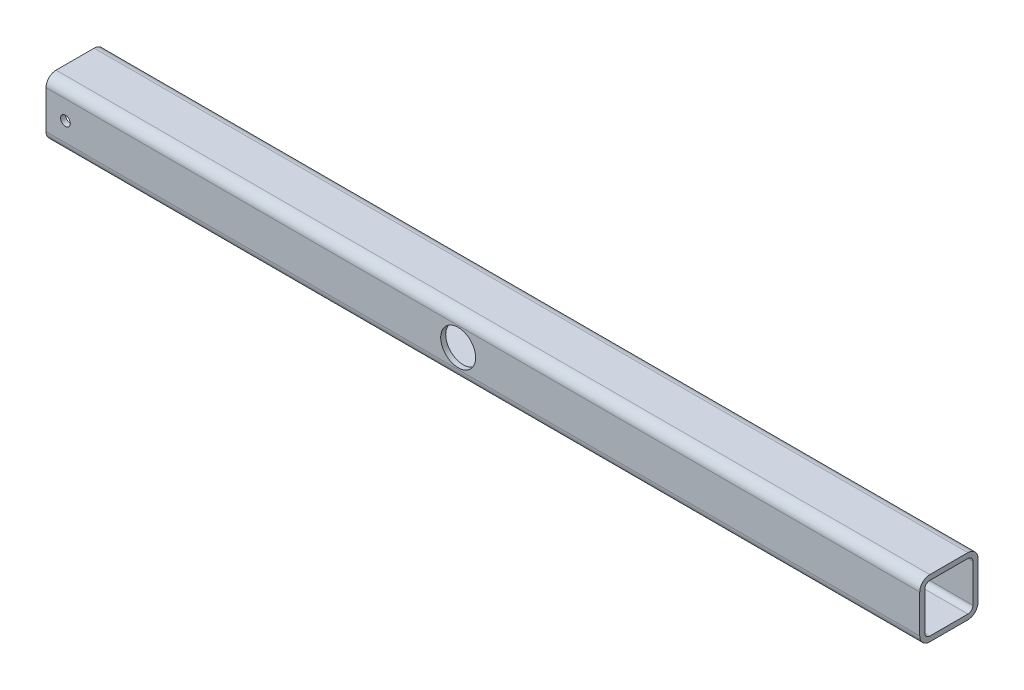
ISO-10303-21;
HEADER;
FILE_DESCRIPTION(('STEP AP214'),'2;1');
FILE_NAME('part.step','',(''),(''),'','','');
FILE_SCHEMA(('AUTOMOTIVE_DESIGN { 1 0 10303 214 1 1 1 1 }'));
ENDSEC;
DATA;
#1=APPLICATION_CONTEXT('core data for automotive mechanical design processes');
#2=APPLICATION_PROTOCOL_DEFINITION('international standard','automotive_design',2000,#1);
#3=PRODUCT_CONTEXT('',#1,'mechanical');
#4=PRODUCT('Part','Part','',(#3));
#5=PRODUCT_RELATED_PRODUCT_CATEGORY('part','',(#4));
#6=PRODUCT_DEFINITION_FORMATION('','',#4);
#7=PRODUCT_DEFINITION_CONTEXT('part definition',#1,'design');
#8=PRODUCT_DEFINITION('design','',#6,#7);
#9=PRODUCT_DEFINITION_SHAPE('','',#8);
#10=(LENGTH_UNIT() NAMED_UNIT(*) SI_UNIT(.MILLI.,.METRE.));
#11=(NAMED_UNIT(*) PLANE_ANGLE_UNIT() SI_UNIT($,.RADIAN.));
#12=(NAMED_UNIT(*) SI_UNIT($,.STERADIAN.) SOLID_ANGLE_UNIT());
#13=UNCERTAINTY_MEASURE_WITH_UNIT(LENGTH_MEASURE(1.E-05),#10,'distance_accuracy_value','');
#14=(GEOMETRIC_REPRESENTATION_CONTEXT(3) GLOBAL_UNCERTAINTY_ASSIGNED_CONTEXT((#13)) GLOBAL_UNIT_ASSIGNED_CONTEXT((#10,
#11,#12)) REPRESENTATION_CONTEXT('',''));
#15=CARTESIAN_POINT('',(0.,0.,0.));
#16=DIRECTION('',(0.,0.,1.));
#17=DIRECTION('',(1.,0.,0.));
#18=AXIS2_PLACEMENT_3D('',#15,#16,#17);
#19=CARTESIAN_POINT('',(225.,9.8,-9.8));
#20=DIRECTION('',(-1.,0.,0.));
#21=DIRECTION('',(0.,0.,1.));
#22=AXIS2_PLACEMENT_3D('',#19,#20,#21);
#23=CYLINDRICAL_SURFACE('',#22,5.2);
#24=CARTESIAN_POINT('',(-225.,9.8,-9.8));
#25=DIRECTION('',(1.,0.,0.));
#26=DIRECTION('',(0.,0.,-1.));
#27=AXIS2_PLACEMENT_3D('',#24,#25,#26);
#28=CIRCLE('',#27,5.2);
#29=CARTESIAN_POINT('',(-225.,9.8,-15.));
#30=VERTEX_POINT('',#29);
#31=CARTESIAN_POINT('',(-225.,15.,-9.8));
#32=VERTEX_POINT('',#31);
#33=EDGE_CURVE('E235',#30,#32,#28,.T.);
#34=ORIENTED_EDGE('',*,*,#33,.T.);
#35=DIRECTION('',(-1.,0.,0.));
#36=VECTOR('',#35,1.);
#37=CARTESIAN_POINT('',(225.,15.,-9.8));
#38=LINE('',#37,#36);
#39=CARTESIAN_POINT('',(225.,15.,-9.8));
#40=VERTEX_POINT('',#39);
#41=EDGE_CURVE('E12',#40,#32,#38,.T.);
#42=ORIENTED_EDGE('',*,*,#41,.F.);
#43=CARTESIAN_POINT('',(225.,9.8,-9.8));
#44=DIRECTION('',(1.,0.,0.));
#45=DIRECTION('',(0.,0.,-1.));
#46=AXIS2_PLACEMENT_3D('',#43,#44,#45);
#47=CIRCLE('',#46,5.2);
#48=CARTESIAN_POINT('',(225.,9.8,-15.));
#49=VERTEX_POINT('',#48);
#50=EDGE_CURVE('E313',#49,#40,#47,.T.);
#51=ORIENTED_EDGE('',*,*,#50,.F.);
#52=DIRECTION('',(-1.,0.,0.));
#53=VECTOR('',#52,1.);
#54=CARTESIAN_POINT('',(225.,9.8,-15.));
#55=LINE('',#54,#53);
#56=EDGE_CURVE('E250',#49,#30,#55,.T.);
#57=ORIENTED_EDGE('',*,*,#56,.T.);
#58=EDGE_LOOP('',(#34,#42,#51,#57));
#59=FACE_BOUND('',#58,.T.);
#60=ADVANCED_FACE('F62',(#59),#23,.T.);
#61=CARTESIAN_POINT('',(225.,15.,-9.8));
#62=DIRECTION('',(0.,-1.,0.));
#63=DIRECTION('',(0.,0.,-1.));
#64=AXIS2_PLACEMENT_3D('',#61,#62,#63);
#65=PLANE('',#64);
#66=DIRECTION('',(0.,0.,1.));
#67=VECTOR('',#66,1.);
#68=CARTESIAN_POINT('',(-225.,15.,-9.8));
#69=LINE('',#68,#67);
#70=CARTESIAN_POINT('',(-225.,15.,9.8));
#71=VERTEX_POINT('',#70);
#72=EDGE_CURVE('E238',#32,#71,#69,.T.);
#73=ORIENTED_EDGE('',*,*,#72,.T.);
#74=DIRECTION('',(-1.,0.,0.));
#75=VECTOR('',#74,1.);
#76=CARTESIAN_POINT('',(225.,15.,9.8));
#77=LINE('',#76,#75);
#78=CARTESIAN_POINT('',(225.,15.,9.8));
#79=VERTEX_POINT('',#78);
#80=EDGE_CURVE('E72',#79,#71,#77,.T.);
#81=ORIENTED_EDGE('',*,*,#80,.F.);
#82=DIRECTION('',(0.,0.,1.));
#83=VECTOR('',#82,1.);
#84=CARTESIAN_POINT('',(225.,15.,-9.8));
#85=LINE('',#84,#83);
#86=EDGE_CURVE('E315',#40,#79,#85,.T.);
#87=ORIENTED_EDGE('',*,*,#86,.F.);
#88=ORIENTED_EDGE('',*,*,#41,.T.);
#89=EDGE_LOOP('',(#73,#81,#87,#88));
#90=FACE_BOUND('',#89,.T.);
#91=ADVANCED_FACE('F353',(#90),#65,.F.);
#92=CARTESIAN_POINT('',(225.,9.8,9.8));
#93=DIRECTION('',(-1.,0.,0.));
#94=DIRECTION('',(0.,0.,1.));
#95=AXIS2_PLACEMENT_3D('',#92,#93,#94);
#96=CYLINDRICAL_SURFACE('',#95,5.2);
#97=CARTESIAN_POINT('',(-225.,9.8,9.8));
#98=DIRECTION('',(1.,0.,0.));
#99=DIRECTION('',(0.,0.,-1.));
#100=AXIS2_PLACEMENT_3D('',#97,#98,#99);
#101=CIRCLE('',#100,5.2);
#102=CARTESIAN_POINT('',(-225.,9.8,15.));
#103=VERTEX_POINT('',#102);
#104=EDGE_CURVE('E240',#71,#103,#101,.T.);
#105=ORIENTED_EDGE('',*,*,#104,.T.);
#106=DIRECTION('',(-1.,0.,0.));
#107=VECTOR('',#106,1.);
#108=CARTESIAN_POINT('',(225.,9.8,15.));
#109=LINE('',#108,#107);
#110=CARTESIAN_POINT('',(225.,9.8,15.));
#111=VERTEX_POINT('',#110);
#112=EDGE_CURVE('E257',#111,#103,#109,.T.);
#113=ORIENTED_EDGE('',*,*,#112,.F.);
#114=CARTESIAN_POINT('',(225.,9.8,9.8));
#115=DIRECTION('',(1.,0.,0.));
#116=DIRECTION('',(0.,0.,-1.));
#117=AXIS2_PLACEMENT_3D('',#114,#115,#116);
#118=CIRCLE('',#117,5.2);
#119=EDGE_CURVE('E317',#79,#111,#118,.T.);
#120=ORIENTED_EDGE('',*,*,#119,.F.);
#121=ORIENTED_EDGE('',*,*,#80,.T.);
#122=EDGE_LOOP('',(#105,#113,#120,#121));
#123=FACE_BOUND('',#122,.T.);
#124=ADVANCED_FACE('F358',(#123),#96,.T.);
#125=CARTESIAN_POINT('',(225.,-9.8,15.));
#126=DIRECTION('',(0.,0.,-1.));
#127=DIRECTION('',(-1.,0.,0.));
#128=AXIS2_PLACEMENT_3D('',#125,#126,#127);
#129=PLANE('',#128);
#130=CARTESIAN_POINT('',(-215.,0.,15.));
#131=DIRECTION('',(0.,0.,1.));
#132=DIRECTION('',(1.,0.,0.));
#133=AXIS2_PLACEMENT_3D('',#130,#131,#132);
#134=CIRCLE('',#133,2.5);
#135=CARTESIAN_POINT('',(-212.5,0.,15.));
#136=VERTEX_POINT('',#135);
#137=EDGE_CURVE('E524',#136,#136,#134,.T.);
#138=ORIENTED_EDGE('',*,*,#137,.F.);
#139=EDGE_LOOP('',(#138));
#140=FACE_BOUND('',#139,.T.);
#141=CARTESIAN_POINT('',(-12.73,0.,15.));
#142=DIRECTION('',(0.,0.,1.));
#143=DIRECTION('',(1.,0.,0.));
#144=AXIS2_PLACEMENT_3D('',#141,#142,#143);
#145=CIRCLE('',#144,9.);
#146=CARTESIAN_POINT('',(-3.72999999999999,0.,15.));
#147=VERTEX_POINT('',#146);
#148=EDGE_CURVE('E531',#147,#147,#145,.T.);
#149=ORIENTED_EDGE('',*,*,#148,.F.);
#150=EDGE_LOOP('',(#149));
#151=FACE_BOUND('',#150,.T.);
#152=DIRECTION('',(0.,-1.,0.));
#153=VECTOR('',#152,1.);
#154=CARTESIAN_POINT('',(-225.,-9.8,15.));
#155=LINE('',#154,#153);
#156=CARTESIAN_POINT('',(-225.,-9.8,15.));
#157=VERTEX_POINT('',#156);
#158=EDGE_CURVE('E242',#103,#157,#155,.T.);
#159=ORIENTED_EDGE('',*,*,#158,.T.);
#160=DIRECTION('',(-1.,0.,0.));
#161=VECTOR('',#160,1.);
#162=CARTESIAN_POINT('',(225.,-9.8,15.));
#163=LINE('',#162,#161);
#164=CARTESIAN_POINT('',(225.,-9.8,15.));
#165=VERTEX_POINT('',#164);
#166=EDGE_CURVE('E254',#165,#157,#163,.T.);
#167=ORIENTED_EDGE('',*,*,#166,.F.);
#168=DIRECTION('',(0.,-1.,0.));
#169=VECTOR('',#168,1.);
#170=CARTESIAN_POINT('',(225.,-9.8,15.));
#171=LINE('',#170,#169);
#172=EDGE_CURVE('E319',#111,#165,#171,.T.);
#173=ORIENTED_EDGE('',*,*,#172,.F.);
#174=ORIENTED_EDGE('',*,*,#112,.T.);
#175=EDGE_LOOP('',(#159,#167,#173,#174));
#176=FACE_BOUND('',#175,.T.);
#177=ADVANCED_FACE('F325',(#140,#151,#176),#129,.F.);
#178=CARTESIAN_POINT('',(225.,-9.8,9.8));
#179=DIRECTION('',(-1.,0.,0.));
#180=DIRECTION('',(0.,0.,1.));
#181=AXIS2_PLACEMENT_3D('',#178,#179,#180);
#182=CYLINDRICAL_SURFACE('',#181,5.2);
#183=CARTESIAN_POINT('',(-225.,-9.8,9.8));
#184=DIRECTION('',(1.,0.,0.));
#185=DIRECTION('',(0.,0.,-1.));
#186=AXIS2_PLACEMENT_3D('',#183,#184,#185);
#187=CIRCLE('',#186,5.2);
#188=CARTESIAN_POINT('',(-225.,-15.,9.8));
#189=VERTEX_POINT('',#188);
#190=EDGE_CURVE('E244',#157,#189,#187,.T.);
#191=ORIENTED_EDGE('',*,*,#190,.T.);
#192=DIRECTION('',(-1.,0.,0.));
#193=VECTOR('',#192,1.);
#194=CARTESIAN_POINT('',(225.,-15.,9.8));
#195=LINE('',#194,#193);
#196=CARTESIAN_POINT('',(225.,-15.,9.8));
#197=VERTEX_POINT('',#196);
#198=EDGE_CURVE('E201',#197,#189,#195,.T.);
#199=ORIENTED_EDGE('',*,*,#198,.F.);
#200=CARTESIAN_POINT('',(225.,-9.8,9.8));
#201=DIRECTION('',(1.,0.,0.));
#202=DIRECTION('',(0.,0.,-1.));
#203=AXIS2_PLACEMENT_3D('',#200,#201,#202);
#204=CIRCLE('',#203,5.2);
#205=EDGE_CURVE('E192',#165,#197,#204,.T.);
#206=ORIENTED_EDGE('',*,*,#205,.F.);
#207=ORIENTED_EDGE('',*,*,#166,.T.);
#208=EDGE_LOOP('',(#191,#199,#206,#207));
#209=FACE_BOUND('',#208,.T.);
#210=ADVANCED_FACE('F329',(#209),#182,.T.);
#211=CARTESIAN_POINT('',(225.,-15.,9.8));
#212=DIRECTION('',(0.,1.,0.));
#213=DIRECTION('',(0.,0.,1.));
#214=AXIS2_PLACEMENT_3D('',#211,#212,#213);
#215=PLANE('',#214);
#216=DIRECTION('',(0.,0.,-1.));
#217=VECTOR('',#216,1.);
#218=CARTESIAN_POINT('',(-225.,-15.,9.8));
#219=LINE('',#218,#217);
#220=CARTESIAN_POINT('',(-225.,-15.,-9.8));
#221=VERTEX_POINT('',#220);
#222=EDGE_CURVE('E200',#189,#221,#219,.T.);
#223=ORIENTED_EDGE('',*,*,#222,.T.);
#224=DIRECTION('',(-1.,0.,0.));
#225=VECTOR('',#224,1.);
#226=CARTESIAN_POINT('',(225.,-15.,-9.8));
#227=LINE('',#226,#225);
#228=CARTESIAN_POINT('',(225.,-15.,-9.8));
#229=VERTEX_POINT('',#228);
#230=EDGE_CURVE('E197',#229,#221,#227,.T.);
#231=ORIENTED_EDGE('',*,*,#230,.F.);
#232=DIRECTION('',(0.,0.,-1.));
#233=VECTOR('',#232,1.);
#234=CARTESIAN_POINT('',(225.,-15.,9.8));
#235=LINE('',#234,#233);
#236=EDGE_CURVE('E186',#197,#229,#235,.T.);
#237=ORIENTED_EDGE('',*,*,#236,.F.);
#238=ORIENTED_EDGE('',*,*,#198,.T.);
#239=EDGE_LOOP('',(#223,#231,#237,#238));
#240=FACE_BOUND('',#239,.T.);
#241=ADVANCED_FACE('F198',(#240),#215,.F.);
#242=CARTESIAN_POINT('',(225.,-9.8,-9.8));
#243=DIRECTION('',(-1.,0.,0.));
#244=DIRECTION('',(0.,0.,1.));
#245=AXIS2_PLACEMENT_3D('',#242,#243,#244);
#246=CYLINDRICAL_SURFACE('',#245,5.2);
#247=CARTESIAN_POINT('',(-225.,-9.8,-9.8));
#248=DIRECTION('',(1.,0.,0.));
#249=DIRECTION('',(0.,0.,-1.));
#250=AXIS2_PLACEMENT_3D('',#247,#248,#249);
#251=CIRCLE('',#250,5.2);
#252=CARTESIAN_POINT('',(-225.,-9.8,-15.));
#253=VERTEX_POINT('',#252);
#254=EDGE_CURVE('E134',#221,#253,#251,.T.);
#255=ORIENTED_EDGE('',*,*,#254,.T.);
#256=DIRECTION('',(-1.,0.,0.));
#257=VECTOR('',#256,1.);
#258=CARTESIAN_POINT('',(225.,-9.8,-15.));
#259=LINE('',#258,#257);
#260=CARTESIAN_POINT('',(225.,-9.8,-15.));
#261=VERTEX_POINT('',#260);
#262=EDGE_CURVE('E202',#261,#253,#259,.T.);
#263=ORIENTED_EDGE('',*,*,#262,.F.);
#264=CARTESIAN_POINT('',(225.,-9.8,-9.8));
#265=DIRECTION('',(1.,0.,0.));
#266=DIRECTION('',(0.,0.,-1.));
#267=AXIS2_PLACEMENT_3D('',#264,#265,#266);
#268=CIRCLE('',#267,5.2);
#269=EDGE_CURVE('E190',#229,#261,#268,.T.);
#270=ORIENTED_EDGE('',*,*,#269,.F.);
#271=ORIENTED_EDGE('',*,*,#230,.T.);
#272=EDGE_LOOP('',(#255,#263,#270,#271));
#273=FACE_BOUND('',#272,.T.);
#274=ADVANCED_FACE('F204',(#273),#246,.T.);
#275=CARTESIAN_POINT('',(225.,9.8,9.8));
#276=DIRECTION('',(-1.,0.,0.));
#277=DIRECTION('',(0.,0.,1.));
#278=AXIS2_PLACEMENT_3D('',#275,#276,#277);
#279=CYLINDRICAL_SURFACE('',#278,2.6);
#280=CARTESIAN_POINT('',(-225.,9.8,9.8));
#281=DIRECTION('',(1.,0.,0.));
#282=DIRECTION('',(0.,0.,-1.));
#283=AXIS2_PLACEMENT_3D('',#280,#281,#282);
#284=CIRCLE('',#283,2.6);
#285=CARTESIAN_POINT('',(-225.,12.4,9.8));
#286=VERTEX_POINT('',#285);
#287=CARTESIAN_POINT('',(-225.,9.8,12.4));
#288=VERTEX_POINT('',#287);
#289=EDGE_CURVE('E210',#286,#288,#284,.T.);
#290=ORIENTED_EDGE('',*,*,#289,.F.);
#291=DIRECTION('',(-1.,0.,0.));
#292=VECTOR('',#291,1.);
#293=CARTESIAN_POINT('',(225.,12.4,9.8));
#294=LINE('',#293,#292);
#295=CARTESIAN_POINT('',(225.,12.4,9.8));
#296=VERTEX_POINT('',#295);
#297=EDGE_CURVE('E66',#296,#286,#294,.T.);
#298=ORIENTED_EDGE('',*,*,#297,.F.);
#299=CARTESIAN_POINT('',(225.,9.8,9.8));
#300=DIRECTION('',(1.,0.,0.));
#301=DIRECTION('',(0.,0.,-1.));
#302=AXIS2_PLACEMENT_3D('',#299,#300,#301);
#303=CIRCLE('',#302,2.6);
#304=CARTESIAN_POINT('',(225.,9.8,12.4));
#305=VERTEX_POINT('',#304);
#306=EDGE_CURVE('E249',#296,#305,#303,.T.);
#307=ORIENTED_EDGE('',*,*,#306,.T.);
#308=DIRECTION('',(-1.,0.,0.));
#309=VECTOR('',#308,1.);
#310=CARTESIAN_POINT('',(225.,9.8,12.4));
#311=LINE('',#310,#309);
#312=EDGE_CURVE('E206',#305,#288,#311,.T.);
#313=ORIENTED_EDGE('',*,*,#312,.T.);
#314=EDGE_LOOP('',(#290,#298,#307,#313));
#315=FACE_BOUND('',#314,.T.);
#316=ADVANCED_FACE('F64',(#315),#279,.F.);
#317=CARTESIAN_POINT('',(225.,12.4,-9.8));
#318=DIRECTION('',(0.,-1.,0.));
#319=DIRECTION('',(0.,0.,-1.));
#320=AXIS2_PLACEMENT_3D('',#317,#318,#319);
#321=PLANE('',#320);
#322=DIRECTION('',(0.,0.,1.));
#323=VECTOR('',#322,1.);
#324=CARTESIAN_POINT('',(-225.,12.4,-9.8));
#325=LINE('',#324,#323);
#326=CARTESIAN_POINT('',(-225.,12.4,-9.8));
#327=VERTEX_POINT('',#326);
#328=EDGE_CURVE('E213',#327,#286,#325,.T.);
#329=ORIENTED_EDGE('',*,*,#328,.F.);
#330=DIRECTION('',(-1.,0.,0.));
#331=VECTOR('',#330,1.);
#332=CARTESIAN_POINT('',(225.,12.4,-9.8));
#333=LINE('',#332,#331);
#334=CARTESIAN_POINT('',(225.,12.4,-9.8));
#335=VERTEX_POINT('',#334);
#336=EDGE_CURVE('E272',#335,#327,#333,.T.);
#337=ORIENTED_EDGE('',*,*,#336,.F.);
#338=DIRECTION('',(0.,0.,1.));
#339=VECTOR('',#338,1.);
#340=CARTESIAN_POINT('',(225.,12.4,-9.8));
#341=LINE('',#340,#339);
#342=EDGE_CURVE('E281',#335,#296,#341,.T.);
#343=ORIENTED_EDGE('',*,*,#342,.T.);
#344=ORIENTED_EDGE('',*,*,#297,.T.);
#345=EDGE_LOOP('',(#329,#337,#343,#344));
#346=FACE_BOUND('',#345,.T.);
#347=ADVANCED_FACE('F279',(#346),#321,.T.);
#348=CARTESIAN_POINT('',(225.,9.8,-9.8));
#349=DIRECTION('',(-1.,0.,0.));
#350=DIRECTION('',(0.,0.,1.));
#351=AXIS2_PLACEMENT_3D('',#348,#349,#350);
#352=CYLINDRICAL_SURFACE('',#351,2.6);
#353=CARTESIAN_POINT('',(-225.,9.8,-9.8));
#354=DIRECTION('',(1.,0.,0.));
#355=DIRECTION('',(0.,0.,-1.));
#356=AXIS2_PLACEMENT_3D('',#353,#354,#355);
#357=CIRCLE('',#356,2.6);
#358=CARTESIAN_POINT('',(-225.,9.8,-12.4));
#359=VERTEX_POINT('',#358);
#360=EDGE_CURVE('E217',#359,#327,#357,.T.);
#361=ORIENTED_EDGE('',*,*,#360,.F.);
#362=DIRECTION('',(-1.,0.,0.));
#363=VECTOR('',#362,1.);
#364=CARTESIAN_POINT('',(225.,9.8,-12.4));
#365=LINE('',#364,#363);
#366=CARTESIAN_POINT('',(225.,9.8,-12.4));
#367=VERTEX_POINT('',#366);
#368=EDGE_CURVE('E271',#367,#359,#365,.T.);
#369=ORIENTED_EDGE('',*,*,#368,.F.);
#370=CARTESIAN_POINT('',(225.,9.8,-9.8));
#371=DIRECTION('',(1.,0.,0.));
#372=DIRECTION('',(0.,0.,-1.));
#373=AXIS2_PLACEMENT_3D('',#370,#371,#372);
#374=CIRCLE('',#373,2.6);
#375=EDGE_CURVE('E289',#367,#335,#374,.T.);
#376=ORIENTED_EDGE('',*,*,#375,.T.);
#377=ORIENTED_EDGE('',*,*,#336,.T.);
#378=EDGE_LOOP('',(#361,#369,#376,#377));
#379=FACE_BOUND('',#378,.T.);
#380=ADVANCED_FACE('F287',(#379),#352,.F.);
#381=CARTESIAN_POINT('',(225.,9.8,-12.4));
#382=DIRECTION('',(0.,0.,1.));
#383=DIRECTION('',(1.,0.,0.));
#384=AXIS2_PLACEMENT_3D('',#381,#382,#383);
#385=PLANE('',#384);
#386=CARTESIAN_POINT('',(-215.,0.,-12.4));
#387=DIRECTION('',(0.,0.,1.));
#388=DIRECTION('',(1.,0.,0.));
#389=AXIS2_PLACEMENT_3D('',#386,#387,#388);
#390=CIRCLE('',#389,2.5);
#391=CARTESIAN_POINT('',(-212.5,0.,-12.4));
#392=VERTEX_POINT('',#391);
#393=EDGE_CURVE('E214',#392,#392,#390,.T.);
#394=ORIENTED_EDGE('',*,*,#393,.F.);
#395=EDGE_LOOP('',(#394));
#396=FACE_BOUND('',#395,.T.);
#397=CARTESIAN_POINT('',(-12.73,0.,-12.4));
#398=DIRECTION('',(0.,0.,1.));
#399=DIRECTION('',(1.,0.,0.));
#400=AXIS2_PLACEMENT_3D('',#397,#398,#399);
#401=CIRCLE('',#400,9.);
#402=CARTESIAN_POINT('',(-3.72999999999999,0.,-12.4));
#403=VERTEX_POINT('',#402);
#404=EDGE_CURVE('E538',#403,#403,#401,.T.);
#405=ORIENTED_EDGE('',*,*,#404,.F.);
#406=EDGE_LOOP('',(#405));
#407=FACE_BOUND('',#406,.T.);
#408=DIRECTION('',(0.,1.,0.));
#409=VECTOR('',#408,1.);
#410=CARTESIAN_POINT('',(-225.,9.8,-12.4));
#411=LINE('',#410,#409);
#412=CARTESIAN_POINT('',(-225.,-9.8,-12.4));
#413=VERTEX_POINT('',#412);
#414=EDGE_CURVE('E220',#413,#359,#411,.T.);
#415=ORIENTED_EDGE('',*,*,#414,.F.);
#416=DIRECTION('',(-1.,0.,0.));
#417=VECTOR('',#416,1.);
#418=CARTESIAN_POINT('',(225.,-9.8,-12.4));
#419=LINE('',#418,#417);
#420=CARTESIAN_POINT('',(225.,-9.8,-12.4));
#421=VERTEX_POINT('',#420);
#422=EDGE_CURVE('E269',#421,#413,#419,.T.);
#423=ORIENTED_EDGE('',*,*,#422,.F.);
#424=DIRECTION('',(0.,1.,0.));
#425=VECTOR('',#424,1.);
#426=CARTESIAN_POINT('',(225.,9.8,-12.4));
#427=LINE('',#426,#425);
#428=EDGE_CURVE('E295',#421,#367,#427,.T.);
#429=ORIENTED_EDGE('',*,*,#428,.T.);
#430=ORIENTED_EDGE('',*,*,#368,.T.);
#431=EDGE_LOOP('',(#415,#423,#429,#430));
#432=FACE_BOUND('',#431,.T.);
#433=ADVANCED_FACE('F298',(#396,#407,#432),#385,.T.);
#434=CARTESIAN_POINT('',(225.,-9.8,-9.8));
#435=DIRECTION('',(-1.,0.,0.));
#436=DIRECTION('',(0.,0.,1.));
#437=AXIS2_PLACEMENT_3D('',#434,#435,#436);
#438=CYLINDRICAL_SURFACE('',#437,2.6);
#439=CARTESIAN_POINT('',(-225.,-9.8,-9.8));
#440=DIRECTION('',(1.,0.,0.));
#441=DIRECTION('',(0.,0.,-1.));
#442=AXIS2_PLACEMENT_3D('',#439,#440,#441);
#443=CIRCLE('',#442,2.6);
#444=CARTESIAN_POINT('',(-225.,-12.4,-9.8));
#445=VERTEX_POINT('',#444);
#446=EDGE_CURVE('E223',#445,#413,#443,.T.);
#447=ORIENTED_EDGE('',*,*,#446,.F.);
#448=DIRECTION('',(-1.,0.,0.));
#449=VECTOR('',#448,1.);
#450=CARTESIAN_POINT('',(225.,-12.4,-9.8));
#451=LINE('',#450,#449);
#452=CARTESIAN_POINT('',(225.,-12.4,-9.8));
#453=VERTEX_POINT('',#452);
#454=EDGE_CURVE('E267',#453,#445,#451,.T.);
#455=ORIENTED_EDGE('',*,*,#454,.F.);
#456=CARTESIAN_POINT('',(225.,-9.8,-9.8));
#457=DIRECTION('',(1.,0.,0.));
#458=DIRECTION('',(0.,0.,-1.));
#459=AXIS2_PLACEMENT_3D('',#456,#457,#458);
#460=CIRCLE('',#459,2.6);
#461=EDGE_CURVE('E299',#453,#421,#460,.T.);
#462=ORIENTED_EDGE('',*,*,#461,.T.);
#463=ORIENTED_EDGE('',*,*,#422,.T.);
#464=EDGE_LOOP('',(#447,#455,#462,#463));
#465=FACE_BOUND('',#464,.T.);
#466=ADVANCED_FACE('F369',(#465),#438,.F.);
#467=CARTESIAN_POINT('',(225.,-12.4,9.8));
#468=DIRECTION('',(0.,1.,0.));
#469=DIRECTION('',(0.,0.,1.));
#470=AXIS2_PLACEMENT_3D('',#467,#468,#469);
#471=PLANE('',#470);
#472=DIRECTION('',(0.,0.,-1.));
#473=VECTOR('',#472,1.);
#474=CARTESIAN_POINT('',(-225.,-12.4,9.8));
#475=LINE('',#474,#473);
#476=CARTESIAN_POINT('',(-225.,-12.4,9.8));
#477=VERTEX_POINT('',#476);
#478=EDGE_CURVE('E226',#477,#445,#475,.T.);
#479=ORIENTED_EDGE('',*,*,#478,.F.);
#480=DIRECTION('',(-1.,0.,0.));
#481=VECTOR('',#480,1.);
#482=CARTESIAN_POINT('',(225.,-12.4,9.8));
#483=LINE('',#482,#481);
#484=CARTESIAN_POINT('',(225.,-12.4,9.8));
#485=VERTEX_POINT('',#484);
#486=EDGE_CURVE('E265',#485,#477,#483,.T.);
#487=ORIENTED_EDGE('',*,*,#486,.F.);
#488=DIRECTION('',(0.,0.,-1.));
#489=VECTOR('',#488,1.);
#490=CARTESIAN_POINT('',(225.,-12.4,9.8));
#491=LINE('',#490,#489);
#492=EDGE_CURVE('E301',#485,#453,#491,.T.);
#493=ORIENTED_EDGE('',*,*,#492,.T.);
#494=ORIENTED_EDGE('',*,*,#454,.T.);
#495=EDGE_LOOP('',(#479,#487,#493,#494));
#496=FACE_BOUND('',#495,.T.);
#497=ADVANCED_FACE('F365',(#496),#471,.T.);
#498=CARTESIAN_POINT('',(225.,-9.8,9.8));
#499=DIRECTION('',(-1.,0.,0.));
#500=DIRECTION('',(0.,0.,1.));
#501=AXIS2_PLACEMENT_3D('',#498,#499,#500);
#502=CYLINDRICAL_SURFACE('',#501,2.6);
#503=CARTESIAN_POINT('',(-225.,-9.8,9.8));
#504=DIRECTION('',(1.,0.,0.));
#505=DIRECTION('',(0.,0.,-1.));
#506=AXIS2_PLACEMENT_3D('',#503,#504,#505);
#507=CIRCLE('',#506,2.6);
#508=CARTESIAN_POINT('',(-225.,-9.8,12.4));
#509=VERTEX_POINT('',#508);
#510=EDGE_CURVE('E229',#509,#477,#507,.T.);
#511=ORIENTED_EDGE('',*,*,#510,.F.);
#512=DIRECTION('',(-1.,0.,0.));
#513=VECTOR('',#512,1.);
#514=CARTESIAN_POINT('',(225.,-9.8,12.4));
#515=LINE('',#514,#513);
#516=CARTESIAN_POINT('',(225.,-9.8,12.4));
#517=VERTEX_POINT('',#516);
#518=EDGE_CURVE('E263',#517,#509,#515,.T.);
#519=ORIENTED_EDGE('',*,*,#518,.F.);
#520=CARTESIAN_POINT('',(225.,-9.8,9.8));
#521=DIRECTION('',(1.,0.,0.));
#522=DIRECTION('',(0.,0.,-1.));
#523=AXIS2_PLACEMENT_3D('',#520,#521,#522);
#524=CIRCLE('',#523,2.6);
#525=EDGE_CURVE('E307',#517,#485,#524,.T.);
#526=ORIENTED_EDGE('',*,*,#525,.T.);
#527=ORIENTED_EDGE('',*,*,#486,.T.);
#528=EDGE_LOOP('',(#511,#519,#526,#527));
#529=FACE_BOUND('',#528,.T.);
#530=ADVANCED_FACE('F345',(#529),#502,.F.);
#531=CARTESIAN_POINT('',(225.,-9.8,12.4));
#532=DIRECTION('',(0.,0.,-1.));
#533=DIRECTION('',(-1.,0.,0.));
#534=AXIS2_PLACEMENT_3D('',#531,#532,#533);
#535=PLANE('',#534);
#536=CARTESIAN_POINT('',(-215.,0.,12.4));
#537=DIRECTION('',(0.,0.,-1.));
#538=DIRECTION('',(-1.,0.,0.));
#539=AXIS2_PLACEMENT_3D('',#536,#537,#538);
#540=CIRCLE('',#539,2.5);
#541=CARTESIAN_POINT('',(-217.5,0.,12.4));
#542=VERTEX_POINT('',#541);
#543=EDGE_CURVE('E521',#542,#542,#540,.T.);
#544=ORIENTED_EDGE('',*,*,#543,.F.);
#545=EDGE_LOOP('',(#544));
#546=FACE_BOUND('',#545,.T.);
#547=CARTESIAN_POINT('',(-12.73,0.,12.4));
#548=DIRECTION('',(0.,0.,-1.));
#549=DIRECTION('',(-1.,0.,0.));
#550=AXIS2_PLACEMENT_3D('',#547,#548,#549);
#551=CIRCLE('',#550,9.);
#552=CARTESIAN_POINT('',(-21.73,0.,12.4));
#553=VERTEX_POINT('',#552);
#554=EDGE_CURVE('E528',#553,#553,#551,.T.);
#555=ORIENTED_EDGE('',*,*,#554,.F.);
#556=EDGE_LOOP('',(#555));
#557=FACE_BOUND('',#556,.T.);
#558=DIRECTION('',(0.,-1.,0.));
#559=VECTOR('',#558,1.);
#560=CARTESIAN_POINT('',(-225.,-9.8,12.4));
#561=LINE('',#560,#559);
#562=EDGE_CURVE('E232',#288,#509,#561,.T.);
#563=ORIENTED_EDGE('',*,*,#562,.F.);
#564=ORIENTED_EDGE('',*,*,#312,.F.);
#565=DIRECTION('',(0.,-1.,0.));
#566=VECTOR('',#565,1.);
#567=CARTESIAN_POINT('',(225.,-9.8,12.4));
#568=LINE('',#567,#566);
#569=EDGE_CURVE('E310',#305,#517,#568,.T.);
#570=ORIENTED_EDGE('',*,*,#569,.T.);
#571=ORIENTED_EDGE('',*,*,#518,.T.);
#572=EDGE_LOOP('',(#563,#564,#570,#571));
#573=FACE_BOUND('',#572,.T.);
#574=ADVANCED_FACE('F337',(#546,#557,#573),#535,.T.);
#575=CARTESIAN_POINT('',(225.,9.8,-15.));
#576=DIRECTION('',(0.,0.,1.));
#577=DIRECTION('',(1.,0.,0.));
#578=AXIS2_PLACEMENT_3D('',#575,#576,#577);
#579=PLANE('',#578);
#580=CARTESIAN_POINT('',(-215.,0.,-15.));
#581=DIRECTION('',(0.,0.,1.));
#582=DIRECTION('',(1.,0.,0.));
#583=AXIS2_PLACEMENT_3D('',#580,#581,#582);
#584=CIRCLE('',#583,2.5);
#585=CARTESIAN_POINT('',(-212.5,0.,-15.));
#586=VERTEX_POINT('',#585);
#587=EDGE_CURVE('E525',#586,#586,#584,.T.);
#588=ORIENTED_EDGE('',*,*,#587,.T.);
#589=EDGE_LOOP('',(#588));
#590=FACE_BOUND('',#589,.T.);
#591=CARTESIAN_POINT('',(-12.73,0.,-15.));
#592=DIRECTION('',(0.,0.,1.));
#593=DIRECTION('',(1.,0.,0.));
#594=AXIS2_PLACEMENT_3D('',#591,#592,#593);
#595=CIRCLE('',#594,9.);
#596=CARTESIAN_POINT('',(-3.72999999999999,0.,-15.));
#597=VERTEX_POINT('',#596);
#598=EDGE_CURVE('E526',#597,#597,#595,.T.);
#599=ORIENTED_EDGE('',*,*,#598,.T.);
#600=EDGE_LOOP('',(#599));
#601=FACE_BOUND('',#600,.T.);
#602=DIRECTION('',(0.,1.,0.));
#603=VECTOR('',#602,1.);
#604=CARTESIAN_POINT('',(-225.,9.8,-15.));
#605=LINE('',#604,#603);
#606=EDGE_CURVE('E140',#253,#30,#605,.T.);
#607=ORIENTED_EDGE('',*,*,#606,.T.);
#608=ORIENTED_EDGE('',*,*,#56,.F.);
#609=DIRECTION('',(0.,1.,0.));
#610=VECTOR('',#609,1.);
#611=CARTESIAN_POINT('',(225.,9.8,-15.));
#612=LINE('',#611,#610);
#613=EDGE_CURVE('E81',#261,#49,#612,.T.);
#614=ORIENTED_EDGE('',*,*,#613,.F.);
#615=ORIENTED_EDGE('',*,*,#262,.T.);
#616=EDGE_LOOP('',(#607,#608,#614,#615));
#617=FACE_BOUND('',#616,.T.);
#618=ADVANCED_FACE('F335',(#590,#601,#617),#579,.F.);
#619=CARTESIAN_POINT('',(225.,9.8,-9.8));
#620=DIRECTION('',(1.,0.,0.));
#621=DIRECTION('',(0.,0.,-1.));
#622=AXIS2_PLACEMENT_3D('',#619,#620,#621);
#623=PLANE('',#622);
#624=ORIENTED_EDGE('',*,*,#306,.F.);
#625=ORIENTED_EDGE('',*,*,#342,.F.);
#626=ORIENTED_EDGE('',*,*,#375,.F.);
#627=ORIENTED_EDGE('',*,*,#428,.F.);
#628=ORIENTED_EDGE('',*,*,#461,.F.);
#629=ORIENTED_EDGE('',*,*,#492,.F.);
#630=ORIENTED_EDGE('',*,*,#525,.F.);
#631=ORIENTED_EDGE('',*,*,#569,.F.);
#632=EDGE_LOOP('',(#624,#625,#626,#627,#628,#629,#630,#631));
#633=FACE_BOUND('',#632,.T.);
#634=ORIENTED_EDGE('',*,*,#50,.T.);
#635=ORIENTED_EDGE('',*,*,#86,.T.);
#636=ORIENTED_EDGE('',*,*,#119,.T.);
#637=ORIENTED_EDGE('',*,*,#172,.T.);
#638=ORIENTED_EDGE('',*,*,#205,.T.);
#639=ORIENTED_EDGE('',*,*,#236,.T.);
#640=ORIENTED_EDGE('',*,*,#269,.T.);
#641=ORIENTED_EDGE('',*,*,#613,.T.);
#642=EDGE_LOOP('',(#634,#635,#636,#637,#638,#639,#640,#641));
#643=FACE_BOUND('',#642,.T.);
#644=ADVANCED_FACE('F188',(#633,#643),#623,.T.);
#645=CARTESIAN_POINT('',(-225.,9.8,-9.8));
#646=DIRECTION('',(1.,0.,0.));
#647=DIRECTION('',(0.,0.,-1.));
#648=AXIS2_PLACEMENT_3D('',#645,#646,#647);
#649=PLANE('',#648);
#650=ORIENTED_EDGE('',*,*,#289,.T.);
#651=ORIENTED_EDGE('',*,*,#562,.T.);
#652=ORIENTED_EDGE('',*,*,#510,.T.);
#653=ORIENTED_EDGE('',*,*,#478,.T.);
#654=ORIENTED_EDGE('',*,*,#446,.T.);
#655=ORIENTED_EDGE('',*,*,#414,.T.);
#656=ORIENTED_EDGE('',*,*,#360,.T.);
#657=ORIENTED_EDGE('',*,*,#328,.T.);
#658=EDGE_LOOP('',(#650,#651,#652,#653,#654,#655,#656,#657));
#659=FACE_BOUND('',#658,.T.);
#660=ORIENTED_EDGE('',*,*,#33,.F.);
#661=ORIENTED_EDGE('',*,*,#606,.F.);
#662=ORIENTED_EDGE('',*,*,#254,.F.);
#663=ORIENTED_EDGE('',*,*,#222,.F.);
#664=ORIENTED_EDGE('',*,*,#190,.F.);
#665=ORIENTED_EDGE('',*,*,#158,.F.);
#666=ORIENTED_EDGE('',*,*,#104,.F.);
#667=ORIENTED_EDGE('',*,*,#72,.F.);
#668=EDGE_LOOP('',(#660,#661,#662,#663,#664,#665,#666,#667));
#669=FACE_BOUND('',#668,.T.);
#670=ADVANCED_FACE('F284',(#659,#669),#649,.F.);
#671=CARTESIAN_POINT('',(-12.73,0.,-15.));
#672=DIRECTION('',(0.,0.,1.));
#673=DIRECTION('',(1.,0.,0.));
#674=AXIS2_PLACEMENT_3D('',#671,#672,#673);
#675=CYLINDRICAL_SURFACE('',#674,9.);
#676=ORIENTED_EDGE('',*,*,#404,.T.);
#677=EDGE_LOOP('',(#676));
#678=FACE_BOUND('',#677,.T.);
#679=ORIENTED_EDGE('',*,*,#598,.F.);
#680=EDGE_LOOP('',(#679));
#681=FACE_BOUND('',#680,.T.);
#682=ADVANCED_FACE('F476',(#678,#681),#675,.F.);
#683=CARTESIAN_POINT('',(-215.,0.,-15.));
#684=DIRECTION('',(0.,0.,1.));
#685=DIRECTION('',(1.,0.,0.));
#686=AXIS2_PLACEMENT_3D('',#683,#684,#685);
#687=CYLINDRICAL_SURFACE('',#686,2.5);
#688=ORIENTED_EDGE('',*,*,#393,.T.);
#689=EDGE_LOOP('',(#688));
#690=FACE_BOUND('',#689,.T.);
#691=ORIENTED_EDGE('',*,*,#587,.F.);
#692=EDGE_LOOP('',(#691));
#693=FACE_BOUND('',#692,.T.);
#694=ADVANCED_FACE('F486',(#690,#693),#687,.F.);
#695=ORIENTED_EDGE('',*,*,#554,.T.);
#696=EDGE_LOOP('',(#695));
#697=FACE_BOUND('',#696,.T.);
#698=ORIENTED_EDGE('',*,*,#148,.T.);
#699=EDGE_LOOP('',(#698));
#700=FACE_BOUND('',#699,.T.);
#701=ADVANCED_FACE('F489',(#697,#700),#675,.F.);
#702=ORIENTED_EDGE('',*,*,#543,.T.);
#703=EDGE_LOOP('',(#702));
#704=FACE_BOUND('',#703,.T.);
#705=ORIENTED_EDGE('',*,*,#137,.T.);
#706=EDGE_LOOP('',(#705));
#707=FACE_BOUND('',#706,.T.);
#708=ADVANCED_FACE('F496',(#704,#707),#687,.F.);
#709=CLOSED_SHELL('',(#60,#91,#124,#177,#210,#241,#274,#316,#347,#380,#433,#466,#497,#530,#574,
#618,#644,#670,#682,#694,#701,#708));
#710=MANIFOLD_SOLID_BREP('B2',#709);
#711=ADVANCED_BREP_SHAPE_REPRESENTATION('',(#18,#710),#14);
#712=SHAPE_DEFINITION_REPRESENTATION(#9,#711);
ENDSEC;
END-ISO-10303-21;
